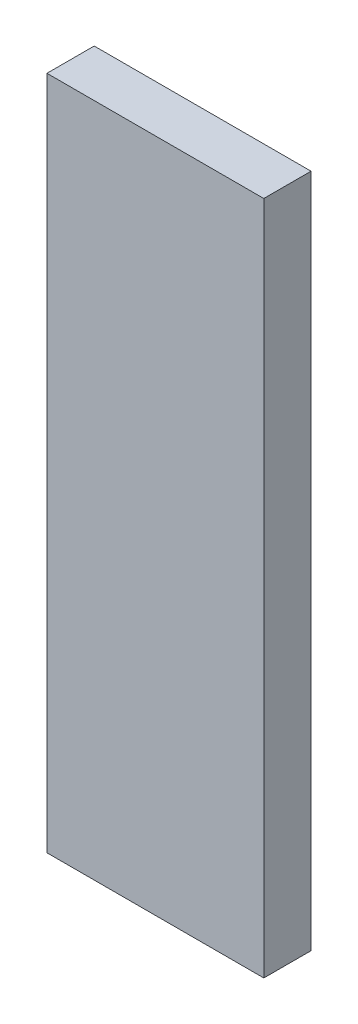
ISO-10303-21;
HEADER;
FILE_DESCRIPTION(('STEP AP214'),'2;1');
FILE_NAME('part.step','',(''),(''),'','','');
FILE_SCHEMA(('AUTOMOTIVE_DESIGN { 1 0 10303 214 1 1 1 1 }'));
ENDSEC;
DATA;
#1=APPLICATION_CONTEXT('core data for automotive mechanical design processes');
#2=APPLICATION_PROTOCOL_DEFINITION('international standard','automotive_design',2000,#1);
#3=PRODUCT_CONTEXT('',#1,'mechanical');
#4=PRODUCT('Part','Part','',(#3));
#5=PRODUCT_RELATED_PRODUCT_CATEGORY('part','',(#4));
#6=PRODUCT_DEFINITION_FORMATION('','',#4);
#7=PRODUCT_DEFINITION_CONTEXT('part definition',#1,'design');
#8=PRODUCT_DEFINITION('design','',#6,#7);
#9=PRODUCT_DEFINITION_SHAPE('','',#8);
#10=(LENGTH_UNIT() NAMED_UNIT(*) SI_UNIT(.MILLI.,.METRE.));
#11=(NAMED_UNIT(*) PLANE_ANGLE_UNIT() SI_UNIT($,.RADIAN.));
#12=(NAMED_UNIT(*) SI_UNIT($,.STERADIAN.) SOLID_ANGLE_UNIT());
#13=UNCERTAINTY_MEASURE_WITH_UNIT(LENGTH_MEASURE(1.E-05),#10,'distance_accuracy_value','');
#14=(GEOMETRIC_REPRESENTATION_CONTEXT(3) GLOBAL_UNCERTAINTY_ASSIGNED_CONTEXT((#13)) GLOBAL_UNIT_ASSIGNED_CONTEXT((#10,
#11,#12)) REPRESENTATION_CONTEXT('',''));
#15=CARTESIAN_POINT('',(0.,0.,0.));
#16=DIRECTION('',(0.,0.,1.));
#17=DIRECTION('',(1.,0.,0.));
#18=AXIS2_PLACEMENT_3D('',#15,#16,#17);
#19=CARTESIAN_POINT('',(-21.7182300884955,31.0897345132743,7.));
#20=DIRECTION('',(1.,0.,0.));
#21=DIRECTION('',(0.,1.,0.));
#22=AXIS2_PLACEMENT_3D('',#19,#20,#21);
#23=PLANE('',#22);
#24=DIRECTION('',(0.,-1.,0.));
#25=VECTOR('',#24,1.);
#26=CARTESIAN_POINT('',(-21.7182300884955,31.0897345132743,0.));
#27=LINE('',#26,#25);
#28=CARTESIAN_POINT('',(-21.7182300884955,31.0897345132743,0.));
#29=VERTEX_POINT('',#28);
#30=CARTESIAN_POINT('',(-21.7182300884955,-68.9102654867257,0.));
#31=VERTEX_POINT('',#30);
#32=EDGE_CURVE('E107',#29,#31,#27,.T.);
#33=ORIENTED_EDGE('',*,*,#32,.T.);
#34=DIRECTION('',(0.,0.,-1.));
#35=VECTOR('',#34,1.);
#36=CARTESIAN_POINT('',(-21.7182300884955,-68.9102654867257,7.));
#37=LINE('',#36,#35);
#38=CARTESIAN_POINT('',(-21.7182300884955,-68.9102654867257,7.));
#39=VERTEX_POINT('',#38);
#40=EDGE_CURVE('E11',#39,#31,#37,.T.);
#41=ORIENTED_EDGE('',*,*,#40,.F.);
#42=DIRECTION('',(0.,-1.,0.));
#43=VECTOR('',#42,1.);
#44=CARTESIAN_POINT('',(-21.7182300884955,31.0897345132743,7.));
#45=LINE('',#44,#43);
#46=CARTESIAN_POINT('',(-21.7182300884955,31.0897345132743,7.));
#47=VERTEX_POINT('',#46);
#48=EDGE_CURVE('E91',#47,#39,#45,.T.);
#49=ORIENTED_EDGE('',*,*,#48,.F.);
#50=DIRECTION('',(0.,0.,-1.));
#51=VECTOR('',#50,1.);
#52=CARTESIAN_POINT('',(-21.7182300884955,31.0897345132743,7.));
#53=LINE('',#52,#51);
#54=EDGE_CURVE('E103',#47,#29,#53,.T.);
#55=ORIENTED_EDGE('',*,*,#54,.T.);
#56=EDGE_LOOP('',(#33,#41,#49,#55));
#57=FACE_BOUND('',#56,.T.);
#58=ADVANCED_FACE('F39',(#57),#23,.F.);
#59=CARTESIAN_POINT('',(-21.7182300884955,-68.9102654867257,7.));
#60=DIRECTION('',(0.,1.,0.));
#61=DIRECTION('',(0.,0.,1.));
#62=AXIS2_PLACEMENT_3D('',#59,#60,#61);
#63=PLANE('',#62);
#64=DIRECTION('',(1.,0.,0.));
#65=VECTOR('',#64,1.);
#66=CARTESIAN_POINT('',(-21.7182300884955,-68.9102654867257,0.));
#67=LINE('',#66,#65);
#68=CARTESIAN_POINT('',(10.4017699115045,-68.9102654867257,0.));
#69=VERTEX_POINT('',#68);
#70=EDGE_CURVE('E96',#31,#69,#67,.T.);
#71=ORIENTED_EDGE('',*,*,#70,.T.);
#72=DIRECTION('',(0.,0.,-1.));
#73=VECTOR('',#72,1.);
#74=CARTESIAN_POINT('',(10.4017699115045,-68.9102654867257,7.));
#75=LINE('',#74,#73);
#76=CARTESIAN_POINT('',(10.4017699115045,-68.9102654867257,7.));
#77=VERTEX_POINT('',#76);
#78=EDGE_CURVE('E48',#77,#69,#75,.T.);
#79=ORIENTED_EDGE('',*,*,#78,.F.);
#80=DIRECTION('',(1.,0.,0.));
#81=VECTOR('',#80,1.);
#82=CARTESIAN_POINT('',(-21.7182300884955,-68.9102654867257,7.));
#83=LINE('',#82,#81);
#84=EDGE_CURVE('E86',#39,#77,#83,.T.);
#85=ORIENTED_EDGE('',*,*,#84,.F.);
#86=ORIENTED_EDGE('',*,*,#40,.T.);
#87=EDGE_LOOP('',(#71,#79,#85,#86));
#88=FACE_BOUND('',#87,.T.);
#89=ADVANCED_FACE('F95',(#88),#63,.F.);
#90=CARTESIAN_POINT('',(10.4017699115044,31.0897345132743,7.));
#91=DIRECTION('',(-1.,0.,0.));
#92=DIRECTION('',(0.,-1.,0.));
#93=AXIS2_PLACEMENT_3D('',#90,#91,#92);
#94=PLANE('',#93);
#95=DIRECTION('',(0.,1.,0.));
#96=VECTOR('',#95,1.);
#97=CARTESIAN_POINT('',(10.4017699115044,31.0897345132743,0.));
#98=LINE('',#97,#96);
#99=CARTESIAN_POINT('',(10.4017699115044,31.0897345132743,0.));
#100=VERTEX_POINT('',#99);
#101=EDGE_CURVE('E73',#69,#100,#98,.T.);
#102=ORIENTED_EDGE('',*,*,#101,.T.);
#103=DIRECTION('',(0.,0.,-1.));
#104=VECTOR('',#103,1.);
#105=CARTESIAN_POINT('',(10.4017699115044,31.0897345132743,7.));
#106=LINE('',#105,#104);
#107=CARTESIAN_POINT('',(10.4017699115044,31.0897345132743,7.));
#108=VERTEX_POINT('',#107);
#109=EDGE_CURVE('E98',#108,#100,#106,.T.);
#110=ORIENTED_EDGE('',*,*,#109,.F.);
#111=DIRECTION('',(0.,1.,0.));
#112=VECTOR('',#111,1.);
#113=CARTESIAN_POINT('',(10.4017699115044,31.0897345132743,7.));
#114=LINE('',#113,#112);
#115=EDGE_CURVE('E89',#77,#108,#114,.T.);
#116=ORIENTED_EDGE('',*,*,#115,.F.);
#117=ORIENTED_EDGE('',*,*,#78,.T.);
#118=EDGE_LOOP('',(#102,#110,#116,#117));
#119=FACE_BOUND('',#118,.T.);
#120=ADVANCED_FACE('F99',(#119),#94,.F.);
#121=CARTESIAN_POINT('',(-21.7182300884955,31.0897345132743,7.));
#122=DIRECTION('',(0.,-1.,0.));
#123=DIRECTION('',(0.,0.,-1.));
#124=AXIS2_PLACEMENT_3D('',#121,#122,#123);
#125=PLANE('',#124);
#126=DIRECTION('',(-1.,0.,0.));
#127=VECTOR('',#126,1.);
#128=CARTESIAN_POINT('',(-21.7182300884955,31.0897345132743,0.));
#129=LINE('',#128,#127);
#130=EDGE_CURVE('E79',#100,#29,#129,.T.);
#131=ORIENTED_EDGE('',*,*,#130,.T.);
#132=ORIENTED_EDGE('',*,*,#54,.F.);
#133=DIRECTION('',(-1.,0.,0.));
#134=VECTOR('',#133,1.);
#135=CARTESIAN_POINT('',(-21.7182300884955,31.0897345132743,7.));
#136=LINE('',#135,#134);
#137=EDGE_CURVE('E56',#108,#47,#136,.T.);
#138=ORIENTED_EDGE('',*,*,#137,.F.);
#139=ORIENTED_EDGE('',*,*,#109,.T.);
#140=EDGE_LOOP('',(#131,#132,#138,#139));
#141=FACE_BOUND('',#140,.T.);
#142=ADVANCED_FACE('F120',(#141),#125,.F.);
#143=CARTESIAN_POINT('',(0.,0.,7.));
#144=DIRECTION('',(0.,0.,1.));
#145=DIRECTION('',(1.,0.,0.));
#146=AXIS2_PLACEMENT_3D('',#143,#144,#145);
#147=PLANE('',#146);
#148=ORIENTED_EDGE('',*,*,#48,.T.);
#149=ORIENTED_EDGE('',*,*,#84,.T.);
#150=ORIENTED_EDGE('',*,*,#115,.T.);
#151=ORIENTED_EDGE('',*,*,#137,.T.);
#152=EDGE_LOOP('',(#148,#149,#150,#151));
#153=FACE_BOUND('',#152,.T.);
#154=ADVANCED_FACE('F87',(#153),#147,.T.);
#155=CARTESIAN_POINT('',(0.,0.,0.));
#156=DIRECTION('',(0.,0.,1.));
#157=DIRECTION('',(1.,0.,0.));
#158=AXIS2_PLACEMENT_3D('',#155,#156,#157);
#159=PLANE('',#158);
#160=ORIENTED_EDGE('',*,*,#32,.F.);
#161=ORIENTED_EDGE('',*,*,#130,.F.);
#162=ORIENTED_EDGE('',*,*,#101,.F.);
#163=ORIENTED_EDGE('',*,*,#70,.F.);
#164=EDGE_LOOP('',(#160,#161,#162,#163));
#165=FACE_BOUND('',#164,.T.);
#166=ADVANCED_FACE('F123',(#165),#159,.F.);
#167=CLOSED_SHELL('',(#58,#89,#120,#142,#154,#166));
#168=MANIFOLD_SOLID_BREP('B2',#167);
#169=ADVANCED_BREP_SHAPE_REPRESENTATION('',(#18,#168),#14);
#170=SHAPE_DEFINITION_REPRESENTATION(#9,#169);
ENDSEC;
END-ISO-10303-21;
